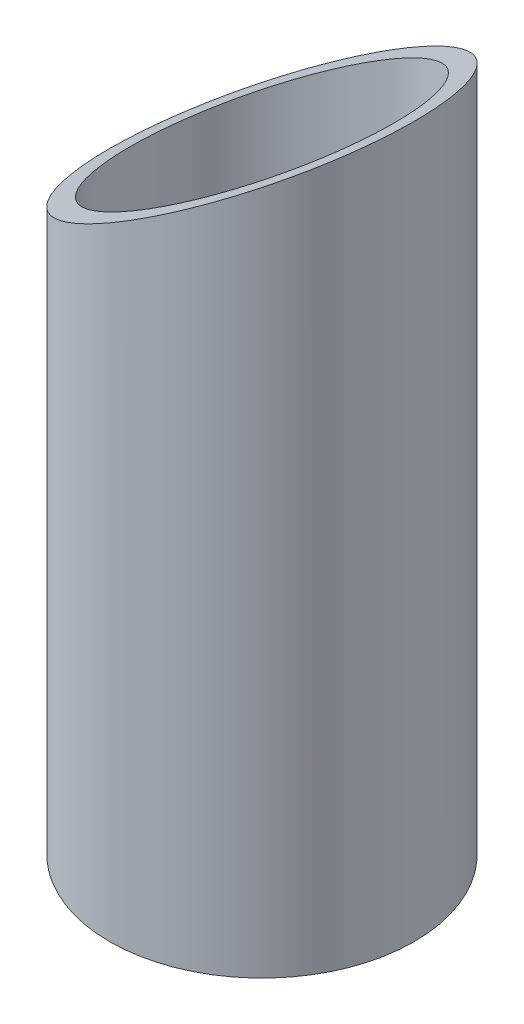
ISO-10303-21;
HEADER;
FILE_DESCRIPTION(('STEP AP214'),'2;1');
FILE_NAME('part.step','',(''),(''),'','','');
FILE_SCHEMA(('AUTOMOTIVE_DESIGN { 1 0 10303 214 1 1 1 1 }'));
ENDSEC;
DATA;
#1=APPLICATION_CONTEXT('core data for automotive mechanical design processes');
#2=APPLICATION_PROTOCOL_DEFINITION('international standard','automotive_design',2000,#1);
#3=PRODUCT_CONTEXT('',#1,'mechanical');
#4=PRODUCT('Part','Part','',(#3));
#5=PRODUCT_RELATED_PRODUCT_CATEGORY('part','',(#4));
#6=PRODUCT_DEFINITION_FORMATION('','',#4);
#7=PRODUCT_DEFINITION_CONTEXT('part definition',#1,'design');
#8=PRODUCT_DEFINITION('design','',#6,#7);
#9=PRODUCT_DEFINITION_SHAPE('','',#8);
#10=(LENGTH_UNIT() NAMED_UNIT(*) SI_UNIT(.MILLI.,.METRE.));
#11=(NAMED_UNIT(*) PLANE_ANGLE_UNIT() SI_UNIT($,.RADIAN.));
#12=(NAMED_UNIT(*) SI_UNIT($,.STERADIAN.) SOLID_ANGLE_UNIT());
#13=UNCERTAINTY_MEASURE_WITH_UNIT(LENGTH_MEASURE(1.E-05),#10,'distance_accuracy_value','');
#14=(GEOMETRIC_REPRESENTATION_CONTEXT(3) GLOBAL_UNCERTAINTY_ASSIGNED_CONTEXT((#13)) GLOBAL_UNIT_ASSIGNED_CONTEXT((#10,
#11,#12)) REPRESENTATION_CONTEXT('',''));
#15=CARTESIAN_POINT('',(0.,0.,0.));
#16=DIRECTION('',(0.,0.,1.));
#17=DIRECTION('',(1.,0.,0.));
#18=AXIS2_PLACEMENT_3D('',#15,#16,#17);
#19=CARTESIAN_POINT('',(0.,70.,0.));
#20=DIRECTION('',(0.,-1.,0.));
#21=DIRECTION('',(0.,0.,-1.));
#22=AXIS2_PLACEMENT_3D('',#19,#20,#21);
#23=CYLINDRICAL_SURFACE('',#22,15.);
#24=CARTESIAN_POINT('',(0.,0.,0.));
#25=DIRECTION('',(0.,1.,0.));
#26=DIRECTION('',(0.,0.,1.));
#27=AXIS2_PLACEMENT_3D('',#24,#25,#26);
#28=CIRCLE('',#27,15.);
#29=CARTESIAN_POINT('',(0.,0.,15.));
#30=VERTEX_POINT('',#29);
#31=EDGE_CURVE('E10',#30,#30,#28,.T.);
#32=ORIENTED_EDGE('',*,*,#31,.T.);
#33=EDGE_LOOP('',(#32));
#34=FACE_BOUND('',#33,.T.);
#35=CARTESIAN_POINT('',(0.,61.3397459621556,0.));
#36=DIRECTION('',(0.500000000000002,-0.866025403784438,0.));
#37=DIRECTION('',(-0.866025403784438,-0.500000000000002,0.));
#38=AXIS2_PLACEMENT_3D('',#35,#36,#37);
#39=ELLIPSE('',#38,17.3205080756888,15.);
#40=CARTESIAN_POINT('',(-15.,52.6794919243112,0.));
#41=VERTEX_POINT('',#40);
#42=EDGE_CURVE('E42',#41,#41,#39,.T.);
#43=ORIENTED_EDGE('',*,*,#42,.T.);
#44=EDGE_LOOP('',(#43));
#45=FACE_BOUND('',#44,.T.);
#46=ADVANCED_FACE('F31',(#34,#45),#23,.T.);
#47=CARTESIAN_POINT('',(0.,0.,0.));
#48=DIRECTION('',(0.,1.,0.));
#49=DIRECTION('',(0.,0.,1.));
#50=AXIS2_PLACEMENT_3D('',#47,#48,#49);
#51=PLANE('',#50);
#52=ORIENTED_EDGE('',*,*,#31,.F.);
#53=EDGE_LOOP('',(#52));
#54=FACE_BOUND('',#53,.T.);
#55=CARTESIAN_POINT('',(0.,0.,0.));
#56=DIRECTION('',(0.,1.,0.));
#57=DIRECTION('',(0.,0.,1.));
#58=AXIS2_PLACEMENT_3D('',#55,#56,#57);
#59=CIRCLE('',#58,13.);
#60=CARTESIAN_POINT('',(0.,0.,13.));
#61=VERTEX_POINT('',#60);
#62=EDGE_CURVE('E38',#61,#61,#59,.T.);
#63=ORIENTED_EDGE('',*,*,#62,.T.);
#64=EDGE_LOOP('',(#63));
#65=FACE_BOUND('',#64,.T.);
#66=ADVANCED_FACE('F57',(#54,#65),#51,.F.);
#67=CARTESIAN_POINT('',(0.,70.,0.));
#68=DIRECTION('',(0.,-1.,0.));
#69=DIRECTION('',(0.,0.,-1.));
#70=AXIS2_PLACEMENT_3D('',#67,#68,#69);
#71=CYLINDRICAL_SURFACE('',#70,13.);
#72=CARTESIAN_POINT('',(0.,61.3397459621556,0.));
#73=DIRECTION('',(0.500000000000002,-0.866025403784438,0.));
#74=DIRECTION('',(-0.866025403784438,-0.500000000000002,0.));
#75=AXIS2_PLACEMENT_3D('',#72,#73,#74);
#76=ELLIPSE('',#75,15.0111069989303,13.);
#77=CARTESIAN_POINT('',(-13.,53.8341924626904,0.));
#78=VERTEX_POINT('',#77);
#79=EDGE_CURVE('E34',#78,#78,#76,.T.);
#80=ORIENTED_EDGE('',*,*,#79,.F.);
#81=EDGE_LOOP('',(#80));
#82=FACE_BOUND('',#81,.T.);
#83=ORIENTED_EDGE('',*,*,#62,.F.);
#84=EDGE_LOOP('',(#83));
#85=FACE_BOUND('',#84,.T.);
#86=ADVANCED_FACE('F54',(#82,#85),#71,.F.);
#87=CARTESIAN_POINT('',(15.,70.,-15.));
#88=DIRECTION('',(0.500000000000002,-0.866025403784438,0.));
#89=DIRECTION('',(0.866025403784438,0.500000000000002,0.));
#90=AXIS2_PLACEMENT_3D('',#87,#88,#89);
#91=PLANE('',#90);
#92=ORIENTED_EDGE('',*,*,#79,.T.);
#93=EDGE_LOOP('',(#92));
#94=FACE_BOUND('',#93,.T.);
#95=ORIENTED_EDGE('',*,*,#42,.F.);
#96=EDGE_LOOP('',(#95));
#97=FACE_BOUND('',#96,.T.);
#98=ADVANCED_FACE('F51',(#94,#97),#91,.F.);
#99=CLOSED_SHELL('',(#46,#66,#86,#98));
#100=MANIFOLD_SOLID_BREP('B2',#99);
#101=ADVANCED_BREP_SHAPE_REPRESENTATION('',(#18,#100),#14);
#102=SHAPE_DEFINITION_REPRESENTATION(#9,#101);
ENDSEC;
END-ISO-10303-21;
